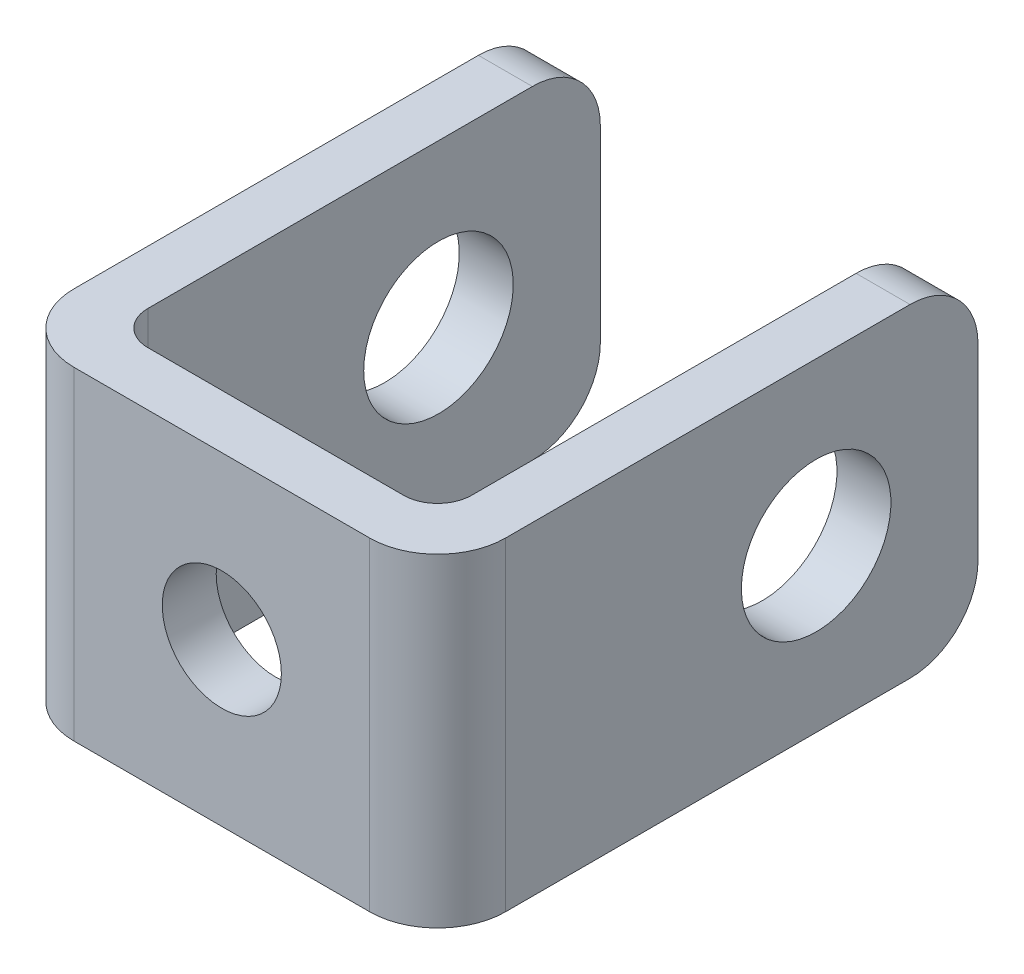
ISO-10303-21;
HEADER;
FILE_DESCRIPTION(('STEP AP214'),'2;1');
FILE_NAME('part.step','',(''),(''),'','','');
FILE_SCHEMA(('AUTOMOTIVE_DESIGN { 1 0 10303 214 1 1 1 1 }'));
ENDSEC;
DATA;
#1=APPLICATION_CONTEXT('core data for automotive mechanical design processes');
#2=APPLICATION_PROTOCOL_DEFINITION('international standard','automotive_design',2000,#1);
#3=PRODUCT_CONTEXT('',#1,'mechanical');
#4=PRODUCT('Part','Part','',(#3));
#5=PRODUCT_RELATED_PRODUCT_CATEGORY('part','',(#4));
#6=PRODUCT_DEFINITION_FORMATION('','',#4);
#7=PRODUCT_DEFINITION_CONTEXT('part definition',#1,'design');
#8=PRODUCT_DEFINITION('design','',#6,#7);
#9=PRODUCT_DEFINITION_SHAPE('','',#8);
#10=(LENGTH_UNIT() NAMED_UNIT(*) SI_UNIT(.MILLI.,.METRE.));
#11=(NAMED_UNIT(*) PLANE_ANGLE_UNIT() SI_UNIT($,.RADIAN.));
#12=(NAMED_UNIT(*) SI_UNIT($,.STERADIAN.) SOLID_ANGLE_UNIT());
#13=UNCERTAINTY_MEASURE_WITH_UNIT(LENGTH_MEASURE(1.E-05),#10,'distance_accuracy_value','');
#14=(GEOMETRIC_REPRESENTATION_CONTEXT(3) GLOBAL_UNCERTAINTY_ASSIGNED_CONTEXT((#13)) GLOBAL_UNIT_ASSIGNED_CONTEXT((#10,
#11,#12)) REPRESENTATION_CONTEXT('',''));
#15=CARTESIAN_POINT('',(0.,0.,0.));
#16=DIRECTION('',(0.,0.,1.));
#17=DIRECTION('',(1.,0.,0.));
#18=AXIS2_PLACEMENT_3D('',#15,#16,#17);
#19=CARTESIAN_POINT('',(12.7,9.525,15.9004));
#20=DIRECTION('',(-1.,0.,0.));
#21=DIRECTION('',(0.,0.,1.));
#22=AXIS2_PLACEMENT_3D('',#19,#20,#21);
#23=PLANE('',#22);
#24=CARTESIAN_POINT('',(12.7,4.7625,4.7625));
#25=DIRECTION('',(-1.,0.,0.));
#26=DIRECTION('',(0.,0.,1.));
#27=AXIS2_PLACEMENT_3D('',#24,#25,#26);
#28=CIRCLE('',#27,2.2);
#29=CARTESIAN_POINT('',(12.7,4.7625,6.9625));
#30=VERTEX_POINT('',#29);
#31=EDGE_CURVE('E351',#30,#30,#28,.T.);
#32=ORIENTED_EDGE('',*,*,#31,.T.);
#33=EDGE_LOOP('',(#32));
#34=FACE_BOUND('',#33,.T.);
#35=DIRECTION('',(0.,0.,-1.));
#36=VECTOR('',#35,1.);
#37=CARTESIAN_POINT('',(12.7,0.,15.9004));
#38=LINE('',#37,#36);
#39=CARTESIAN_POINT('',(12.7,0.,13.9004));
#40=VERTEX_POINT('',#39);
#41=CARTESIAN_POINT('',(12.7,0.,2.));
#42=VERTEX_POINT('',#41);
#43=EDGE_CURVE('E326',#40,#42,#38,.T.);
#44=ORIENTED_EDGE('',*,*,#43,.T.);
#45=CARTESIAN_POINT('',(12.7,2.,2.));
#46=DIRECTION('',(-1.,0.,0.));
#47=DIRECTION('',(0.,0.,1.));
#48=AXIS2_PLACEMENT_3D('',#45,#46,#47);
#49=CIRCLE('',#48,2.);
#50=CARTESIAN_POINT('',(12.7,2.,0.));
#51=VERTEX_POINT('',#50);
#52=EDGE_CURVE('E265',#42,#51,#49,.F.);
#53=ORIENTED_EDGE('',*,*,#52,.T.);
#54=DIRECTION('',(0.,-1.,0.));
#55=VECTOR('',#54,1.);
#56=CARTESIAN_POINT('',(12.7,9.525,0.));
#57=LINE('',#56,#55);
#58=CARTESIAN_POINT('',(12.7,7.525,0.));
#59=VERTEX_POINT('',#58);
#60=EDGE_CURVE('E186',#59,#51,#57,.T.);
#61=ORIENTED_EDGE('',*,*,#60,.F.);
#62=CARTESIAN_POINT('',(12.7,7.525,2.));
#63=DIRECTION('',(-1.,0.,0.));
#64=DIRECTION('',(0.,0.,1.));
#65=AXIS2_PLACEMENT_3D('',#62,#63,#64);
#66=CIRCLE('',#65,2.);
#67=CARTESIAN_POINT('',(12.7,9.525,2.));
#68=VERTEX_POINT('',#67);
#69=EDGE_CURVE('E262',#59,#68,#66,.F.);
#70=ORIENTED_EDGE('',*,*,#69,.T.);
#71=DIRECTION('',(0.,0.,-1.));
#72=VECTOR('',#71,1.);
#73=CARTESIAN_POINT('',(12.7,9.525,15.9004));
#74=LINE('',#73,#72);
#75=CARTESIAN_POINT('',(12.7,9.525,13.9004));
#76=VERTEX_POINT('',#75);
#77=EDGE_CURVE('E317',#76,#68,#74,.T.);
#78=ORIENTED_EDGE('',*,*,#77,.F.);
#79=DIRECTION('',(0.,-1.,0.));
#80=VECTOR('',#79,1.);
#81=CARTESIAN_POINT('',(12.7,9.525,13.9004));
#82=LINE('',#81,#80);
#83=EDGE_CURVE('E208',#76,#40,#82,.T.);
#84=ORIENTED_EDGE('',*,*,#83,.T.);
#85=EDGE_LOOP('',(#44,#53,#61,#70,#78,#84));
#86=FACE_BOUND('',#85,.T.);
#87=ADVANCED_FACE('F39',(#34,#86),#23,.F.);
#88=CARTESIAN_POINT('',(11.1125,9.525,0.));
#89=DIRECTION('',(0.,0.,-1.));
#90=DIRECTION('',(-1.,0.,0.));
#91=AXIS2_PLACEMENT_3D('',#88,#89,#90);
#92=PLANE('',#91);
#93=ORIENTED_EDGE('',*,*,#60,.T.);
#94=DIRECTION('',(1.,0.,0.));
#95=VECTOR('',#94,1.);
#96=CARTESIAN_POINT('',(11.1125,2.,0.));
#97=LINE('',#96,#95);
#98=CARTESIAN_POINT('',(11.1125,2.,0.));
#99=VERTEX_POINT('',#98);
#100=EDGE_CURVE('E61',#51,#99,#97,.F.);
#101=ORIENTED_EDGE('',*,*,#100,.T.);
#102=DIRECTION('',(0.,-1.,0.));
#103=VECTOR('',#102,1.);
#104=CARTESIAN_POINT('',(11.1125,9.525,0.));
#105=LINE('',#104,#103);
#106=CARTESIAN_POINT('',(11.1125,7.525,0.));
#107=VERTEX_POINT('',#106);
#108=EDGE_CURVE('E192',#107,#99,#105,.T.);
#109=ORIENTED_EDGE('',*,*,#108,.F.);
#110=DIRECTION('',(1.,0.,0.));
#111=VECTOR('',#110,1.);
#112=CARTESIAN_POINT('',(12.7,7.525,0.));
#113=LINE('',#112,#111);
#114=EDGE_CURVE('E268',#107,#59,#113,.T.);
#115=ORIENTED_EDGE('',*,*,#114,.T.);
#116=EDGE_LOOP('',(#93,#101,#109,#115));
#117=FACE_BOUND('',#116,.T.);
#118=ADVANCED_FACE('F390',(#117),#92,.T.);
#119=CARTESIAN_POINT('',(11.1125,9.525,15.9004));
#120=DIRECTION('',(-1.,0.,0.));
#121=DIRECTION('',(0.,0.,1.));
#122=AXIS2_PLACEMENT_3D('',#119,#120,#121);
#123=PLANE('',#122);
#124=CARTESIAN_POINT('',(11.1125,4.7625,4.7625));
#125=DIRECTION('',(-1.,0.,0.));
#126=DIRECTION('',(0.,0.,1.));
#127=AXIS2_PLACEMENT_3D('',#124,#125,#126);
#128=CIRCLE('',#127,2.2);
#129=CARTESIAN_POINT('',(11.1125,4.7625,6.9625));
#130=VERTEX_POINT('',#129);
#131=EDGE_CURVE('E330',#130,#130,#128,.T.);
#132=ORIENTED_EDGE('',*,*,#131,.F.);
#133=EDGE_LOOP('',(#132));
#134=FACE_BOUND('',#133,.T.);
#135=ORIENTED_EDGE('',*,*,#108,.T.);
#136=CARTESIAN_POINT('',(11.1125,2.,2.));
#137=DIRECTION('',(-1.,0.,0.));
#138=DIRECTION('',(0.,0.,1.));
#139=AXIS2_PLACEMENT_3D('',#136,#137,#138);
#140=CIRCLE('',#139,2.);
#141=CARTESIAN_POINT('',(11.1125,0.,2.));
#142=VERTEX_POINT('',#141);
#143=EDGE_CURVE('E277',#99,#142,#140,.T.);
#144=ORIENTED_EDGE('',*,*,#143,.T.);
#145=DIRECTION('',(0.,0.,-1.));
#146=VECTOR('',#145,1.);
#147=CARTESIAN_POINT('',(11.1125,0.,15.9004));
#148=LINE('',#147,#146);
#149=CARTESIAN_POINT('',(11.1125,0.,13.3129));
#150=VERTEX_POINT('',#149);
#151=EDGE_CURVE('E180',#150,#142,#148,.T.);
#152=ORIENTED_EDGE('',*,*,#151,.F.);
#153=DIRECTION('',(0.,-1.,0.));
#154=VECTOR('',#153,1.);
#155=CARTESIAN_POINT('',(11.1125,9.525,13.3129));
#156=LINE('',#155,#154);
#157=CARTESIAN_POINT('',(11.1125,9.525,13.3129));
#158=VERTEX_POINT('',#157);
#159=EDGE_CURVE('E190',#150,#158,#156,.F.);
#160=ORIENTED_EDGE('',*,*,#159,.T.);
#161=DIRECTION('',(0.,0.,-1.));
#162=VECTOR('',#161,1.);
#163=CARTESIAN_POINT('',(11.1125,9.525,15.9004));
#164=LINE('',#163,#162);
#165=CARTESIAN_POINT('',(11.1125,9.525,2.));
#166=VERTEX_POINT('',#165);
#167=EDGE_CURVE('E339',#158,#166,#164,.T.);
#168=ORIENTED_EDGE('',*,*,#167,.T.);
#169=CARTESIAN_POINT('',(11.1125,7.525,2.));
#170=DIRECTION('',(-1.,0.,0.));
#171=DIRECTION('',(0.,0.,1.));
#172=AXIS2_PLACEMENT_3D('',#169,#170,#171);
#173=CIRCLE('',#172,2.);
#174=EDGE_CURVE('E274',#166,#107,#173,.T.);
#175=ORIENTED_EDGE('',*,*,#174,.T.);
#176=EDGE_LOOP('',(#135,#144,#152,#160,#168,#175));
#177=FACE_BOUND('',#176,.T.);
#178=ADVANCED_FACE('F393',(#134,#177),#123,.T.);
#179=CARTESIAN_POINT('',(0.,9.525,14.3129));
#180=DIRECTION('',(0.,0.,-1.));
#181=DIRECTION('',(-1.,0.,0.));
#182=AXIS2_PLACEMENT_3D('',#179,#180,#181);
#183=PLANE('',#182);
#184=CARTESIAN_POINT('',(6.35,4.7625,14.3129));
#185=DIRECTION('',(0.,0.,-1.));
#186=DIRECTION('',(-1.,0.,0.));
#187=AXIS2_PLACEMENT_3D('',#184,#185,#186);
#188=CIRCLE('',#187,1.7525);
#189=CARTESIAN_POINT('',(4.5975,4.7625,14.3129));
#190=VERTEX_POINT('',#189);
#191=EDGE_CURVE('E360',#190,#190,#188,.F.);
#192=ORIENTED_EDGE('',*,*,#191,.T.);
#193=EDGE_LOOP('',(#192));
#194=FACE_BOUND('',#193,.T.);
#195=DIRECTION('',(1.,0.,0.));
#196=VECTOR('',#195,1.);
#197=CARTESIAN_POINT('',(0.,9.525,14.3129));
#198=LINE('',#197,#196);
#199=CARTESIAN_POINT('',(2.5875,9.525,14.3129));
#200=VERTEX_POINT('',#199);
#201=CARTESIAN_POINT('',(10.1125,9.525,14.3129));
#202=VERTEX_POINT('',#201);
#203=EDGE_CURVE('E336',#200,#202,#198,.T.);
#204=ORIENTED_EDGE('',*,*,#203,.T.);
#205=DIRECTION('',(0.,-1.,0.));
#206=VECTOR('',#205,1.);
#207=CARTESIAN_POINT('',(10.1125,0.,14.3129));
#208=LINE('',#207,#206);
#209=CARTESIAN_POINT('',(10.1125,0.,14.3129));
#210=VERTEX_POINT('',#209);
#211=EDGE_CURVE('E178',#202,#210,#208,.T.);
#212=ORIENTED_EDGE('',*,*,#211,.T.);
#213=DIRECTION('',(1.,0.,0.));
#214=VECTOR('',#213,1.);
#215=CARTESIAN_POINT('',(0.,0.,14.3129));
#216=LINE('',#215,#214);
#217=CARTESIAN_POINT('',(2.5875,0.,14.3129));
#218=VERTEX_POINT('',#217);
#219=EDGE_CURVE('E159',#218,#210,#216,.T.);
#220=ORIENTED_EDGE('',*,*,#219,.F.);
#221=DIRECTION('',(0.,-1.,0.));
#222=VECTOR('',#221,1.);
#223=CARTESIAN_POINT('',(2.5875,9.525,14.3129));
#224=LINE('',#223,#222);
#225=EDGE_CURVE('E175',#218,#200,#224,.F.);
#226=ORIENTED_EDGE('',*,*,#225,.T.);
#227=EDGE_LOOP('',(#204,#212,#220,#226));
#228=FACE_BOUND('',#227,.T.);
#229=ADVANCED_FACE('F174',(#194,#228),#183,.T.);
#230=CARTESIAN_POINT('',(1.5875,9.525,0.));
#231=DIRECTION('',(1.,0.,0.));
#232=DIRECTION('',(0.,0.,-1.));
#233=AXIS2_PLACEMENT_3D('',#230,#231,#232);
#234=PLANE('',#233);
#235=CARTESIAN_POINT('',(1.5875,4.7625,4.7625));
#236=DIRECTION('',(1.,0.,0.));
#237=DIRECTION('',(0.,0.,-1.));
#238=AXIS2_PLACEMENT_3D('',#235,#236,#237);
#239=CIRCLE('',#238,2.2);
#240=CARTESIAN_POINT('',(1.5875,4.7625,6.9625));
#241=VERTEX_POINT('',#240);
#242=EDGE_CURVE('E347',#241,#241,#239,.T.);
#243=ORIENTED_EDGE('',*,*,#242,.F.);
#244=EDGE_LOOP('',(#243));
#245=FACE_BOUND('',#244,.T.);
#246=DIRECTION('',(0.,0.,1.));
#247=VECTOR('',#246,1.);
#248=CARTESIAN_POINT('',(1.5875,0.,0.));
#249=LINE('',#248,#247);
#250=CARTESIAN_POINT('',(1.5875,0.,2.));
#251=VERTEX_POINT('',#250);
#252=CARTESIAN_POINT('',(1.5875,0.,13.3129));
#253=VERTEX_POINT('',#252);
#254=EDGE_CURVE('E162',#251,#253,#249,.T.);
#255=ORIENTED_EDGE('',*,*,#254,.F.);
#256=CARTESIAN_POINT('',(1.5875,2.,2.));
#257=DIRECTION('',(1.,0.,0.));
#258=DIRECTION('',(0.,0.,-1.));
#259=AXIS2_PLACEMENT_3D('',#256,#257,#258);
#260=CIRCLE('',#259,2.);
#261=CARTESIAN_POINT('',(1.5875,2.,0.));
#262=VERTEX_POINT('',#261);
#263=EDGE_CURVE('E246',#251,#262,#260,.T.);
#264=ORIENTED_EDGE('',*,*,#263,.T.);
#265=DIRECTION('',(0.,-1.,0.));
#266=VECTOR('',#265,1.);
#267=CARTESIAN_POINT('',(1.5875,9.525,0.));
#268=LINE('',#267,#266);
#269=CARTESIAN_POINT('',(1.5875,7.525,0.));
#270=VERTEX_POINT('',#269);
#271=EDGE_CURVE('E302',#270,#262,#268,.T.);
#272=ORIENTED_EDGE('',*,*,#271,.F.);
#273=CARTESIAN_POINT('',(1.5875,7.525,2.));
#274=DIRECTION('',(1.,0.,0.));
#275=DIRECTION('',(0.,0.,-1.));
#276=AXIS2_PLACEMENT_3D('',#273,#274,#275);
#277=CIRCLE('',#276,2.);
#278=CARTESIAN_POINT('',(1.5875,9.525,2.));
#279=VERTEX_POINT('',#278);
#280=EDGE_CURVE('E243',#270,#279,#277,.T.);
#281=ORIENTED_EDGE('',*,*,#280,.T.);
#282=DIRECTION('',(0.,0.,1.));
#283=VECTOR('',#282,1.);
#284=CARTESIAN_POINT('',(1.5875,9.525,0.));
#285=LINE('',#284,#283);
#286=CARTESIAN_POINT('',(1.5875,9.525,13.3129));
#287=VERTEX_POINT('',#286);
#288=EDGE_CURVE('E285',#279,#287,#285,.T.);
#289=ORIENTED_EDGE('',*,*,#288,.T.);
#290=DIRECTION('',(0.,-1.,0.));
#291=VECTOR('',#290,1.);
#292=CARTESIAN_POINT('',(1.5875,0.,13.3129));
#293=LINE('',#292,#291);
#294=EDGE_CURVE('E198',#287,#253,#293,.T.);
#295=ORIENTED_EDGE('',*,*,#294,.T.);
#296=EDGE_LOOP('',(#255,#264,#272,#281,#289,#295));
#297=FACE_BOUND('',#296,.T.);
#298=ADVANCED_FACE('F306',(#245,#297),#234,.T.);
#299=CARTESIAN_POINT('',(0.,9.525,0.));
#300=DIRECTION('',(0.,0.,-1.));
#301=DIRECTION('',(-1.,0.,0.));
#302=AXIS2_PLACEMENT_3D('',#299,#300,#301);
#303=PLANE('',#302);
#304=ORIENTED_EDGE('',*,*,#271,.T.);
#305=DIRECTION('',(1.,0.,0.));
#306=VECTOR('',#305,1.);
#307=CARTESIAN_POINT('',(0.,2.,0.));
#308=LINE('',#307,#306);
#309=CARTESIAN_POINT('',(0.,2.,0.));
#310=VERTEX_POINT('',#309);
#311=EDGE_CURVE('E253',#262,#310,#308,.F.);
#312=ORIENTED_EDGE('',*,*,#311,.T.);
#313=DIRECTION('',(0.,-1.,0.));
#314=VECTOR('',#313,1.);
#315=CARTESIAN_POINT('',(0.,9.525,0.));
#316=LINE('',#315,#314);
#317=CARTESIAN_POINT('',(0.,7.525,0.));
#318=VERTEX_POINT('',#317);
#319=EDGE_CURVE('E304',#318,#310,#316,.T.);
#320=ORIENTED_EDGE('',*,*,#319,.F.);
#321=DIRECTION('',(1.,0.,0.));
#322=VECTOR('',#321,1.);
#323=CARTESIAN_POINT('',(1.5875,7.525,0.));
#324=LINE('',#323,#322);
#325=EDGE_CURVE('E249',#318,#270,#324,.T.);
#326=ORIENTED_EDGE('',*,*,#325,.T.);
#327=EDGE_LOOP('',(#304,#312,#320,#326));
#328=FACE_BOUND('',#327,.T.);
#329=ADVANCED_FACE('F301',(#328),#303,.T.);
#330=CARTESIAN_POINT('',(0.,9.525,0.));
#331=DIRECTION('',(1.,0.,0.));
#332=DIRECTION('',(0.,0.,-1.));
#333=AXIS2_PLACEMENT_3D('',#330,#331,#332);
#334=PLANE('',#333);
#335=CARTESIAN_POINT('',(0.,4.7625,4.7625));
#336=DIRECTION('',(-1.,0.,0.));
#337=DIRECTION('',(0.,0.,1.));
#338=AXIS2_PLACEMENT_3D('',#335,#336,#337);
#339=CIRCLE('',#338,2.2);
#340=CARTESIAN_POINT('',(0.,4.7625,6.9625));
#341=VERTEX_POINT('',#340);
#342=EDGE_CURVE('E352',#341,#341,#339,.T.);
#343=ORIENTED_EDGE('',*,*,#342,.F.);
#344=EDGE_LOOP('',(#343));
#345=FACE_BOUND('',#344,.T.);
#346=ORIENTED_EDGE('',*,*,#319,.T.);
#347=CARTESIAN_POINT('',(0.,2.,2.));
#348=DIRECTION('',(1.,0.,0.));
#349=DIRECTION('',(0.,0.,-1.));
#350=AXIS2_PLACEMENT_3D('',#347,#348,#349);
#351=CIRCLE('',#350,2.);
#352=CARTESIAN_POINT('',(0.,0.,2.));
#353=VERTEX_POINT('',#352);
#354=EDGE_CURVE('E259',#310,#353,#351,.F.);
#355=ORIENTED_EDGE('',*,*,#354,.T.);
#356=DIRECTION('',(0.,0.,1.));
#357=VECTOR('',#356,1.);
#358=CARTESIAN_POINT('',(0.,0.,0.));
#359=LINE('',#358,#357);
#360=CARTESIAN_POINT('',(0.,0.,13.9004));
#361=VERTEX_POINT('',#360);
#362=EDGE_CURVE('E318',#353,#361,#359,.T.);
#363=ORIENTED_EDGE('',*,*,#362,.T.);
#364=DIRECTION('',(0.,-1.,0.));
#365=VECTOR('',#364,1.);
#366=CARTESIAN_POINT('',(0.,9.525,13.9004));
#367=LINE('',#366,#365);
#368=CARTESIAN_POINT('',(0.,9.525,13.9004));
#369=VERTEX_POINT('',#368);
#370=EDGE_CURVE('E232',#361,#369,#367,.F.);
#371=ORIENTED_EDGE('',*,*,#370,.T.);
#372=DIRECTION('',(0.,0.,1.));
#373=VECTOR('',#372,1.);
#374=CARTESIAN_POINT('',(0.,9.525,0.));
#375=LINE('',#374,#373);
#376=CARTESIAN_POINT('',(0.,9.525,2.));
#377=VERTEX_POINT('',#376);
#378=EDGE_CURVE('E284',#377,#369,#375,.T.);
#379=ORIENTED_EDGE('',*,*,#378,.F.);
#380=CARTESIAN_POINT('',(0.,7.525,2.));
#381=DIRECTION('',(1.,0.,0.));
#382=DIRECTION('',(0.,0.,-1.));
#383=AXIS2_PLACEMENT_3D('',#380,#381,#382);
#384=CIRCLE('',#383,2.);
#385=EDGE_CURVE('E256',#377,#318,#384,.F.);
#386=ORIENTED_EDGE('',*,*,#385,.T.);
#387=EDGE_LOOP('',(#346,#355,#363,#371,#379,#386));
#388=FACE_BOUND('',#387,.T.);
#389=ADVANCED_FACE('F290',(#345,#388),#334,.F.);
#390=CARTESIAN_POINT('',(0.,9.525,15.9004));
#391=DIRECTION('',(0.,0.,-1.));
#392=DIRECTION('',(-1.,0.,0.));
#393=AXIS2_PLACEMENT_3D('',#390,#391,#392);
#394=PLANE('',#393);
#395=CARTESIAN_POINT('',(6.35,4.7625,15.9004));
#396=DIRECTION('',(0.,0.,1.));
#397=DIRECTION('',(1.,0.,0.));
#398=AXIS2_PLACEMENT_3D('',#395,#396,#397);
#399=CIRCLE('',#398,1.7525);
#400=CARTESIAN_POINT('',(8.1025,4.7625,15.9004));
#401=VERTEX_POINT('',#400);
#402=EDGE_CURVE('E356',#401,#401,#399,.T.);
#403=ORIENTED_EDGE('',*,*,#402,.F.);
#404=EDGE_LOOP('',(#403));
#405=FACE_BOUND('',#404,.T.);
#406=DIRECTION('',(1.,0.,0.));
#407=VECTOR('',#406,1.);
#408=CARTESIAN_POINT('',(0.,0.,15.9004));
#409=LINE('',#408,#407);
#410=CARTESIAN_POINT('',(2.,0.,15.9004));
#411=VERTEX_POINT('',#410);
#412=CARTESIAN_POINT('',(10.7,0.,15.9004));
#413=VERTEX_POINT('',#412);
#414=EDGE_CURVE('E313',#411,#413,#409,.T.);
#415=ORIENTED_EDGE('',*,*,#414,.T.);
#416=DIRECTION('',(0.,-1.,0.));
#417=VECTOR('',#416,1.);
#418=CARTESIAN_POINT('',(10.7,9.525,15.9004));
#419=LINE('',#418,#417);
#420=CARTESIAN_POINT('',(10.7,9.525,15.9004));
#421=VERTEX_POINT('',#420);
#422=EDGE_CURVE('E223',#413,#421,#419,.F.);
#423=ORIENTED_EDGE('',*,*,#422,.T.);
#424=DIRECTION('',(1.,0.,0.));
#425=VECTOR('',#424,1.);
#426=CARTESIAN_POINT('',(0.,9.525,15.9004));
#427=LINE('',#426,#425);
#428=CARTESIAN_POINT('',(2.,9.525,15.9004));
#429=VERTEX_POINT('',#428);
#430=EDGE_CURVE('E295',#429,#421,#427,.T.);
#431=ORIENTED_EDGE('',*,*,#430,.F.);
#432=DIRECTION('',(0.,-1.,0.));
#433=VECTOR('',#432,1.);
#434=CARTESIAN_POINT('',(2.,9.525,15.9004));
#435=LINE('',#434,#433);
#436=EDGE_CURVE('E219',#429,#411,#435,.T.);
#437=ORIENTED_EDGE('',*,*,#436,.T.);
#438=EDGE_LOOP('',(#415,#423,#431,#437));
#439=FACE_BOUND('',#438,.T.);
#440=ADVANCED_FACE('F370',(#405,#439),#394,.F.);
#441=CARTESIAN_POINT('',(0.,9.525,0.));
#442=DIRECTION('',(0.,-1.,0.));
#443=DIRECTION('',(-1.,0.,0.));
#444=AXIS2_PLACEMENT_3D('',#441,#442,#443);
#445=PLANE('',#444);
#446=ORIENTED_EDGE('',*,*,#77,.T.);
#447=DIRECTION('',(1.,0.,0.));
#448=VECTOR('',#447,1.);
#449=CARTESIAN_POINT('',(11.1125,9.525,2.));
#450=LINE('',#449,#448);
#451=EDGE_CURVE('E11',#68,#166,#450,.F.);
#452=ORIENTED_EDGE('',*,*,#451,.T.);
#453=ORIENTED_EDGE('',*,*,#167,.F.);
#454=CARTESIAN_POINT('',(10.1125,9.525,13.3129));
#455=DIRECTION('',(0.,-1.,0.));
#456=DIRECTION('',(0.,0.,-1.));
#457=AXIS2_PLACEMENT_3D('',#454,#455,#456);
#458=CIRCLE('',#457,1.);
#459=EDGE_CURVE('E169',#158,#202,#458,.T.);
#460=ORIENTED_EDGE('',*,*,#459,.T.);
#461=ORIENTED_EDGE('',*,*,#203,.F.);
#462=CARTESIAN_POINT('',(2.5875,9.525,13.3129));
#463=DIRECTION('',(0.,-1.,0.));
#464=DIRECTION('',(0.,0.,-1.));
#465=AXIS2_PLACEMENT_3D('',#462,#463,#464);
#466=CIRCLE('',#465,1.);
#467=EDGE_CURVE('E168',#200,#287,#466,.T.);
#468=ORIENTED_EDGE('',*,*,#467,.T.);
#469=ORIENTED_EDGE('',*,*,#288,.F.);
#470=DIRECTION('',(1.,0.,0.));
#471=VECTOR('',#470,1.);
#472=CARTESIAN_POINT('',(0.,9.525,2.));
#473=LINE('',#472,#471);
#474=EDGE_CURVE('E48',#279,#377,#473,.F.);
#475=ORIENTED_EDGE('',*,*,#474,.T.);
#476=ORIENTED_EDGE('',*,*,#378,.T.);
#477=CARTESIAN_POINT('',(2.,9.525,13.9004));
#478=DIRECTION('',(0.,-1.,0.));
#479=DIRECTION('',(0.,0.,-1.));
#480=AXIS2_PLACEMENT_3D('',#477,#478,#479);
#481=CIRCLE('',#480,2.);
#482=EDGE_CURVE('E226',#369,#429,#481,.F.);
#483=ORIENTED_EDGE('',*,*,#482,.T.);
#484=ORIENTED_EDGE('',*,*,#430,.T.);
#485=CARTESIAN_POINT('',(10.7,9.525,13.9004));
#486=DIRECTION('',(0.,-1.,0.));
#487=DIRECTION('',(0.,0.,-1.));
#488=AXIS2_PLACEMENT_3D('',#485,#486,#487);
#489=CIRCLE('',#488,2.);
#490=EDGE_CURVE('E229',#421,#76,#489,.F.);
#491=ORIENTED_EDGE('',*,*,#490,.T.);
#492=EDGE_LOOP('',(#446,#452,#453,#460,#461,#468,#469,#475,#476,#483,#484,#491));
#493=FACE_BOUND('',#492,.T.);
#494=ADVANCED_FACE('F283',(#493),#445,.F.);
#495=CARTESIAN_POINT('',(0.,0.,0.));
#496=DIRECTION('',(0.,-1.,0.));
#497=DIRECTION('',(-1.,0.,0.));
#498=AXIS2_PLACEMENT_3D('',#495,#496,#497);
#499=PLANE('',#498);
#500=ORIENTED_EDGE('',*,*,#362,.F.);
#501=DIRECTION('',(1.,0.,0.));
#502=VECTOR('',#501,1.);
#503=CARTESIAN_POINT('',(0.,0.,2.));
#504=LINE('',#503,#502);
#505=EDGE_CURVE('E240',#353,#251,#504,.T.);
#506=ORIENTED_EDGE('',*,*,#505,.T.);
#507=ORIENTED_EDGE('',*,*,#254,.T.);
#508=CARTESIAN_POINT('',(2.5875,0.,13.3129));
#509=DIRECTION('',(0.,-1.,0.));
#510=DIRECTION('',(0.,0.,-1.));
#511=AXIS2_PLACEMENT_3D('',#508,#509,#510);
#512=CIRCLE('',#511,1.);
#513=EDGE_CURVE('E155',#253,#218,#512,.F.);
#514=ORIENTED_EDGE('',*,*,#513,.T.);
#515=ORIENTED_EDGE('',*,*,#219,.T.);
#516=CARTESIAN_POINT('',(10.1125,0.,13.3129));
#517=DIRECTION('',(0.,-1.,0.));
#518=DIRECTION('',(0.,0.,-1.));
#519=AXIS2_PLACEMENT_3D('',#516,#517,#518);
#520=CIRCLE('',#519,1.);
#521=EDGE_CURVE('E201',#210,#150,#520,.F.);
#522=ORIENTED_EDGE('',*,*,#521,.T.);
#523=ORIENTED_EDGE('',*,*,#151,.T.);
#524=DIRECTION('',(1.,0.,0.));
#525=VECTOR('',#524,1.);
#526=CARTESIAN_POINT('',(0.,0.,2.));
#527=LINE('',#526,#525);
#528=EDGE_CURVE('E236',#142,#42,#527,.T.);
#529=ORIENTED_EDGE('',*,*,#528,.T.);
#530=ORIENTED_EDGE('',*,*,#43,.F.);
#531=CARTESIAN_POINT('',(10.7,0.,13.9004));
#532=DIRECTION('',(0.,-1.,0.));
#533=DIRECTION('',(0.,0.,-1.));
#534=AXIS2_PLACEMENT_3D('',#531,#532,#533);
#535=CIRCLE('',#534,2.);
#536=EDGE_CURVE('E216',#40,#413,#535,.T.);
#537=ORIENTED_EDGE('',*,*,#536,.T.);
#538=ORIENTED_EDGE('',*,*,#414,.F.);
#539=CARTESIAN_POINT('',(2.,0.,13.9004));
#540=DIRECTION('',(0.,-1.,0.));
#541=DIRECTION('',(0.,0.,-1.));
#542=AXIS2_PLACEMENT_3D('',#539,#540,#541);
#543=CIRCLE('',#542,2.);
#544=EDGE_CURVE('E212',#411,#361,#543,.T.);
#545=ORIENTED_EDGE('',*,*,#544,.T.);
#546=EDGE_LOOP('',(#500,#506,#507,#514,#515,#522,#523,#529,#530,#537,#538,#545));
#547=FACE_BOUND('',#546,.T.);
#548=ADVANCED_FACE('F158',(#547),#499,.T.);
#549=CARTESIAN_POINT('',(10.1125,9.525,13.3129));
#550=DIRECTION('',(0.,1.,0.));
#551=DIRECTION('',(0.,0.,1.));
#552=AXIS2_PLACEMENT_3D('',#549,#550,#551);
#553=CYLINDRICAL_SURFACE('',#552,1.);
#554=ORIENTED_EDGE('',*,*,#459,.F.);
#555=ORIENTED_EDGE('',*,*,#159,.F.);
#556=ORIENTED_EDGE('',*,*,#521,.F.);
#557=ORIENTED_EDGE('',*,*,#211,.F.);
#558=EDGE_LOOP('',(#554,#555,#556,#557));
#559=FACE_BOUND('',#558,.T.);
#560=ADVANCED_FACE('F401',(#559),#553,.F.);
#561=CARTESIAN_POINT('',(2.5875,9.525,13.3129));
#562=DIRECTION('',(0.,1.,0.));
#563=DIRECTION('',(0.,0.,1.));
#564=AXIS2_PLACEMENT_3D('',#561,#562,#563);
#565=CYLINDRICAL_SURFACE('',#564,1.);
#566=ORIENTED_EDGE('',*,*,#467,.F.);
#567=ORIENTED_EDGE('',*,*,#225,.F.);
#568=ORIENTED_EDGE('',*,*,#513,.F.);
#569=ORIENTED_EDGE('',*,*,#294,.F.);
#570=EDGE_LOOP('',(#566,#567,#568,#569));
#571=FACE_BOUND('',#570,.T.);
#572=ADVANCED_FACE('F183',(#571),#565,.F.);
#573=CARTESIAN_POINT('',(10.7,9.525,13.9004));
#574=DIRECTION('',(0.,-1.,0.));
#575=DIRECTION('',(0.,0.,-1.));
#576=AXIS2_PLACEMENT_3D('',#573,#574,#575);
#577=CYLINDRICAL_SURFACE('',#576,2.);
#578=ORIENTED_EDGE('',*,*,#490,.F.);
#579=ORIENTED_EDGE('',*,*,#422,.F.);
#580=ORIENTED_EDGE('',*,*,#536,.F.);
#581=ORIENTED_EDGE('',*,*,#83,.F.);
#582=EDGE_LOOP('',(#578,#579,#580,#581));
#583=FACE_BOUND('',#582,.T.);
#584=ADVANCED_FACE('F380',(#583),#577,.T.);
#585=CARTESIAN_POINT('',(2.,9.525,13.9004));
#586=DIRECTION('',(0.,-1.,0.));
#587=DIRECTION('',(0.,0.,-1.));
#588=AXIS2_PLACEMENT_3D('',#585,#586,#587);
#589=CYLINDRICAL_SURFACE('',#588,2.);
#590=ORIENTED_EDGE('',*,*,#482,.F.);
#591=ORIENTED_EDGE('',*,*,#370,.F.);
#592=ORIENTED_EDGE('',*,*,#544,.F.);
#593=ORIENTED_EDGE('',*,*,#436,.F.);
#594=EDGE_LOOP('',(#590,#591,#592,#593));
#595=FACE_BOUND('',#594,.T.);
#596=ADVANCED_FACE('F480',(#595),#589,.T.);
#597=CARTESIAN_POINT('',(0.,2.,2.));
#598=DIRECTION('',(1.,0.,0.));
#599=DIRECTION('',(0.,0.,-1.));
#600=AXIS2_PLACEMENT_3D('',#597,#598,#599);
#601=CYLINDRICAL_SURFACE('',#600,2.);
#602=ORIENTED_EDGE('',*,*,#354,.F.);
#603=ORIENTED_EDGE('',*,*,#311,.F.);
#604=ORIENTED_EDGE('',*,*,#263,.F.);
#605=ORIENTED_EDGE('',*,*,#505,.F.);
#606=EDGE_LOOP('',(#602,#603,#604,#605));
#607=FACE_BOUND('',#606,.T.);
#608=ADVANCED_FACE('F473',(#607),#601,.T.);
#609=CARTESIAN_POINT('',(0.,2.,2.));
#610=DIRECTION('',(1.,0.,0.));
#611=DIRECTION('',(0.,0.,-1.));
#612=AXIS2_PLACEMENT_3D('',#609,#610,#611);
#613=CYLINDRICAL_SURFACE('',#612,2.);
#614=ORIENTED_EDGE('',*,*,#143,.F.);
#615=ORIENTED_EDGE('',*,*,#100,.F.);
#616=ORIENTED_EDGE('',*,*,#52,.F.);
#617=ORIENTED_EDGE('',*,*,#528,.F.);
#618=EDGE_LOOP('',(#614,#615,#616,#617));
#619=FACE_BOUND('',#618,.T.);
#620=ADVANCED_FACE('F397',(#619),#613,.T.);
#621=CARTESIAN_POINT('',(11.1125,7.525,2.));
#622=DIRECTION('',(-1.,0.,0.));
#623=DIRECTION('',(0.,0.,1.));
#624=AXIS2_PLACEMENT_3D('',#621,#622,#623);
#625=CYLINDRICAL_SURFACE('',#624,2.);
#626=ORIENTED_EDGE('',*,*,#174,.F.);
#627=ORIENTED_EDGE('',*,*,#451,.F.);
#628=ORIENTED_EDGE('',*,*,#69,.F.);
#629=ORIENTED_EDGE('',*,*,#114,.F.);
#630=EDGE_LOOP('',(#626,#627,#628,#629));
#631=FACE_BOUND('',#630,.T.);
#632=ADVANCED_FACE('F389',(#631),#625,.T.);
#633=CARTESIAN_POINT('',(0.,7.525,2.));
#634=DIRECTION('',(-1.,0.,0.));
#635=DIRECTION('',(0.,0.,1.));
#636=AXIS2_PLACEMENT_3D('',#633,#634,#635);
#637=CYLINDRICAL_SURFACE('',#636,2.);
#638=ORIENTED_EDGE('',*,*,#385,.F.);
#639=ORIENTED_EDGE('',*,*,#474,.F.);
#640=ORIENTED_EDGE('',*,*,#280,.F.);
#641=ORIENTED_EDGE('',*,*,#325,.F.);
#642=EDGE_LOOP('',(#638,#639,#640,#641));
#643=FACE_BOUND('',#642,.T.);
#644=ADVANCED_FACE('F41',(#643),#637,.T.);
#645=CARTESIAN_POINT('',(12.7,4.7625,4.7625));
#646=DIRECTION('',(-1.,0.,0.));
#647=DIRECTION('',(0.,0.,1.));
#648=AXIS2_PLACEMENT_3D('',#645,#646,#647);
#649=CYLINDRICAL_SURFACE('',#648,2.2);
#650=CARTESIAN_POINT('',(1.5875,4.7625,6.9625));
#651=CARTESIAN_POINT('',(1.57096354166667,4.7625,6.9625));
#652=CARTESIAN_POINT('',(1.55442708333333,4.7625,6.9625));
#653=CARTESIAN_POINT('',(1.52135416666667,4.7625,6.9625));
#654=CARTESIAN_POINT('',(1.50481770833334,4.7625,6.9625));
#655=CARTESIAN_POINT('',(1.47174479166667,4.7625,6.9625));
#656=CARTESIAN_POINT('',(1.45520833333334,4.7625,6.9625));
#657=CARTESIAN_POINT('',(1.42213541666667,4.7625,6.9625));
#658=CARTESIAN_POINT('',(1.40559895833333,4.7625,6.9625));
#659=CARTESIAN_POINT('',(1.37252604166667,4.7625,6.9625));
#660=CARTESIAN_POINT('',(1.35598958333334,4.7625,6.9625));
#661=CARTESIAN_POINT('',(1.32291666666667,4.7625,6.9625));
#662=CARTESIAN_POINT('',(1.30638020833334,4.7625,6.9625));
#663=CARTESIAN_POINT('',(1.27330729166667,4.7625,6.9625));
#664=CARTESIAN_POINT('',(1.25677083333333,4.7625,6.9625));
#665=CARTESIAN_POINT('',(1.22369791666667,4.7625,6.9625));
#666=CARTESIAN_POINT('',(1.20716145833333,4.7625,6.9625));
#667=CARTESIAN_POINT('',(1.17408854166667,4.7625,6.9625));
#668=CARTESIAN_POINT('',(1.15755208333333,4.7625,6.9625));
#669=CARTESIAN_POINT('',(1.12447916666667,4.7625,6.9625));
#670=CARTESIAN_POINT('',(1.10794270833333,4.7625,6.9625));
#671=CARTESIAN_POINT('',(1.07486979166667,4.7625,6.9625));
#672=CARTESIAN_POINT('',(1.05833333333333,4.7625,6.9625));
#673=CARTESIAN_POINT('',(1.02526041666667,4.7625,6.9625));
#674=CARTESIAN_POINT('',(1.00872395833333,4.7625,6.9625));
#675=CARTESIAN_POINT('',(0.975651041666668,4.7625,6.9625));
#676=CARTESIAN_POINT('',(0.959114583333335,4.7625,6.9625));
#677=CARTESIAN_POINT('',(0.926041666666668,4.7625,6.9625));
#678=CARTESIAN_POINT('',(0.909505208333334,4.7625,6.9625));
#679=CARTESIAN_POINT('',(0.876432291666668,4.7625,6.9625));
#680=CARTESIAN_POINT('',(0.859895833333335,4.7625,6.9625));
#681=CARTESIAN_POINT('',(0.826822916666668,4.7625,6.9625));
#682=CARTESIAN_POINT('',(0.810286458333335,4.7625,6.9625));
#683=CARTESIAN_POINT('',(0.777213541666667,4.7625,6.9625));
#684=CARTESIAN_POINT('',(0.760677083333334,4.7625,6.9625));
#685=CARTESIAN_POINT('',(0.727604166666667,4.7625,6.9625));
#686=CARTESIAN_POINT('',(0.711067708333335,4.7625,6.9625));
#687=CARTESIAN_POINT('',(0.677994791666668,4.7625,6.9625));
#688=CARTESIAN_POINT('',(0.661458333333334,4.7625,6.9625));
#689=CARTESIAN_POINT('',(0.628385416666667,4.7625,6.9625));
#690=CARTESIAN_POINT('',(0.611848958333334,4.7625,6.9625));
#691=CARTESIAN_POINT('',(0.578776041666667,4.7625,6.9625));
#692=CARTESIAN_POINT('',(0.562239583333334,4.7625,6.9625));
#693=CARTESIAN_POINT('',(0.529166666666668,4.7625,6.9625));
#694=CARTESIAN_POINT('',(0.512630208333334,4.7625,6.9625));
#695=CARTESIAN_POINT('',(0.479557291666667,4.7625,6.9625));
#696=CARTESIAN_POINT('',(0.463020833333334,4.7625,6.9625));
#697=CARTESIAN_POINT('',(0.429947916666667,4.7625,6.9625));
#698=CARTESIAN_POINT('',(0.413411458333334,4.7625,6.9625));
#699=CARTESIAN_POINT('',(0.380338541666668,4.7625,6.9625));
#700=CARTESIAN_POINT('',(0.363802083333334,4.7625,6.9625));
#701=CARTESIAN_POINT('',(0.330729166666667,4.7625,6.9625));
#702=CARTESIAN_POINT('',(0.314192708333334,4.7625,6.9625));
#703=CARTESIAN_POINT('',(0.281119791666667,4.7625,6.9625));
#704=CARTESIAN_POINT('',(0.264583333333334,4.7625,6.9625));
#705=CARTESIAN_POINT('',(0.231510416666668,4.7625,6.9625));
#706=CARTESIAN_POINT('',(0.214973958333334,4.7625,6.9625));
#707=CARTESIAN_POINT('',(0.181901041666667,4.7625,6.9625));
#708=CARTESIAN_POINT('',(0.165364583333334,4.7625,6.9625));
#709=CARTESIAN_POINT('',(0.132291666666667,4.7625,6.9625));
#710=CARTESIAN_POINT('',(0.115755208333333,4.7625,6.9625));
#711=CARTESIAN_POINT('',(0.0826822916666665,4.7625,6.9625));
#712=CARTESIAN_POINT('',(0.0661458333333336,4.7625,6.9625));
#713=CARTESIAN_POINT('',(0.0330729166666671,4.7625,6.9625));
#714=CARTESIAN_POINT('',(0.0165364583333335,4.7625,6.9625));
#715=CARTESIAN_POINT('',(0.,4.7625,6.9625));
#716=B_SPLINE_CURVE_WITH_KNOTS('',3,(#650,#651,#652,#653,#654,#655,#656,#657,#658,#659,#660,
#661,#662,#663,#664,#665,#666,#667,#668,#669,#670,#671,#672,#673,#674,#675,#676,#677,#678,#679,
#680,#681,#682,#683,#684,#685,#686,#687,#688,#689,#690,#691,#692,#693,#694,#695,#696,#697,#698,
#699,#700,#701,#702,#703,#704,#705,#706,#707,#708,#709,#710,#711,#712,#713,#714,#715),
.UNSPECIFIED.,.F.,.F.,(4,2,2,2,2,2,2,2,2,2,2,2,2,2,2,2,2,2,2,2,2,2,2,2,2,2,2,2,2,2,2,2,4),(0.,
0.0496093750000006,0.0992187499999995,0.148828125,0.198437500000001,0.248046875,0.29765625,
0.347265625000001,0.396875000000001,0.446484375,0.496093750000001,0.545703125000002,0.5953125,
0.644921875000001,0.694531250000002,0.744140625,0.793750000000001,0.843359375000002,
0.892968750000001,0.942578125000001,0.992187500000002,1.041796875,1.09140625,1.141015625,
1.190625,1.240234375,1.28984375,1.339453125,1.3890625,1.438671875,1.48828125,1.537890625,
1.5875),.UNSPECIFIED.);
#717=EDGE_CURVE('BSEAM434',#241,#341,#716,.T.);
#718=ORIENTED_EDGE('',*,*,#242,.T.);
#719=ORIENTED_EDGE('',*,*,#342,.T.);
#720=ORIENTED_EDGE('',*,*,#717,.T.);
#721=ORIENTED_EDGE('',*,*,#717,.F.);
#722=EDGE_LOOP('',(#718,#720,#719,#721));
#723=FACE_BOUND('',#722,.T.);
#724=ADVANCED_FACE('F434',(#723),#649,.F.);
#725=CARTESIAN_POINT('',(11.1125,4.7625,6.9625));
#726=CARTESIAN_POINT('',(11.1290364583333,4.7625,6.9625));
#727=CARTESIAN_POINT('',(11.1455729166667,4.7625,6.9625));
#728=CARTESIAN_POINT('',(11.1786458333333,4.7625,6.9625));
#729=CARTESIAN_POINT('',(11.1951822916667,4.7625,6.9625));
#730=CARTESIAN_POINT('',(11.2282552083333,4.7625,6.9625));
#731=CARTESIAN_POINT('',(11.2447916666667,4.7625,6.9625));
#732=CARTESIAN_POINT('',(11.2778645833333,4.7625,6.9625));
#733=CARTESIAN_POINT('',(11.2944010416667,4.7625,6.9625));
#734=CARTESIAN_POINT('',(11.3274739583333,4.7625,6.9625));
#735=CARTESIAN_POINT('',(11.3440104166667,4.7625,6.9625));
#736=CARTESIAN_POINT('',(11.3770833333333,4.7625,6.9625));
#737=CARTESIAN_POINT('',(11.3936197916667,4.7625,6.9625));
#738=CARTESIAN_POINT('',(11.4266927083333,4.7625,6.9625));
#739=CARTESIAN_POINT('',(11.4432291666667,4.7625,6.9625));
#740=CARTESIAN_POINT('',(11.4763020833333,4.7625,6.9625));
#741=CARTESIAN_POINT('',(11.4928385416667,4.7625,6.9625));
#742=CARTESIAN_POINT('',(11.5259114583333,4.7625,6.9625));
#743=CARTESIAN_POINT('',(11.5424479166667,4.7625,6.9625));
#744=CARTESIAN_POINT('',(11.5755208333333,4.7625,6.9625));
#745=CARTESIAN_POINT('',(11.5920572916667,4.7625,6.9625));
#746=CARTESIAN_POINT('',(11.6251302083333,4.7625,6.9625));
#747=CARTESIAN_POINT('',(11.6416666666667,4.7625,6.9625));
#748=CARTESIAN_POINT('',(11.6747395833333,4.7625,6.9625));
#749=CARTESIAN_POINT('',(11.6912760416667,4.7625,6.9625));
#750=CARTESIAN_POINT('',(11.7243489583333,4.7625,6.9625));
#751=CARTESIAN_POINT('',(11.7408854166667,4.7625,6.9625));
#752=CARTESIAN_POINT('',(11.7739583333333,4.7625,6.9625));
#753=CARTESIAN_POINT('',(11.7904947916667,4.7625,6.9625));
#754=CARTESIAN_POINT('',(11.8235677083333,4.7625,6.9625));
#755=CARTESIAN_POINT('',(11.8401041666667,4.7625,6.9625));
#756=CARTESIAN_POINT('',(11.8731770833333,4.7625,6.9625));
#757=CARTESIAN_POINT('',(11.8897135416667,4.7625,6.9625));
#758=CARTESIAN_POINT('',(11.9227864583333,4.7625,6.9625));
#759=CARTESIAN_POINT('',(11.9393229166667,4.7625,6.9625));
#760=CARTESIAN_POINT('',(11.9723958333333,4.7625,6.9625));
#761=CARTESIAN_POINT('',(11.9889322916667,4.7625,6.9625));
#762=CARTESIAN_POINT('',(12.0220052083333,4.7625,6.9625));
#763=CARTESIAN_POINT('',(12.0385416666667,4.7625,6.9625));
#764=CARTESIAN_POINT('',(12.0716145833333,4.7625,6.9625));
#765=CARTESIAN_POINT('',(12.0881510416667,4.7625,6.9625));
#766=CARTESIAN_POINT('',(12.1212239583333,4.7625,6.9625));
#767=CARTESIAN_POINT('',(12.1377604166667,4.7625,6.9625));
#768=CARTESIAN_POINT('',(12.1708333333333,4.7625,6.9625));
#769=CARTESIAN_POINT('',(12.1873697916667,4.7625,6.9625));
#770=CARTESIAN_POINT('',(12.2204427083333,4.7625,6.9625));
#771=CARTESIAN_POINT('',(12.2369791666667,4.7625,6.9625));
#772=CARTESIAN_POINT('',(12.2700520833333,4.7625,6.9625));
#773=CARTESIAN_POINT('',(12.2865885416667,4.7625,6.9625));
#774=CARTESIAN_POINT('',(12.3196614583333,4.7625,6.9625));
#775=CARTESIAN_POINT('',(12.3361979166667,4.7625,6.9625));
#776=CARTESIAN_POINT('',(12.3692708333333,4.7625,6.9625));
#777=CARTESIAN_POINT('',(12.3858072916667,4.7625,6.9625));
#778=CARTESIAN_POINT('',(12.4188802083333,4.7625,6.9625));
#779=CARTESIAN_POINT('',(12.4354166666667,4.7625,6.9625));
#780=CARTESIAN_POINT('',(12.4684895833333,4.7625,6.9625));
#781=CARTESIAN_POINT('',(12.4850260416667,4.7625,6.9625));
#782=CARTESIAN_POINT('',(12.5180989583333,4.7625,6.9625));
#783=CARTESIAN_POINT('',(12.5346354166667,4.7625,6.9625));
#784=CARTESIAN_POINT('',(12.5677083333333,4.7625,6.9625));
#785=CARTESIAN_POINT('',(12.5842447916667,4.7625,6.9625));
#786=CARTESIAN_POINT('',(12.6173177083333,4.7625,6.9625));
#787=CARTESIAN_POINT('',(12.6338541666667,4.7625,6.9625));
#788=CARTESIAN_POINT('',(12.6669270833333,4.7625,6.9625));
#789=CARTESIAN_POINT('',(12.6834635416667,4.7625,6.9625));
#790=CARTESIAN_POINT('',(12.7,4.7625,6.9625));
#791=B_SPLINE_CURVE_WITH_KNOTS('',3,(#725,#726,#727,#728,#729,#730,#731,#732,#733,#734,#735,
#736,#737,#738,#739,#740,#741,#742,#743,#744,#745,#746,#747,#748,#749,#750,#751,#752,#753,#754,
#755,#756,#757,#758,#759,#760,#761,#762,#763,#764,#765,#766,#767,#768,#769,#770,#771,#772,#773,
#774,#775,#776,#777,#778,#779,#780,#781,#782,#783,#784,#785,#786,#787,#788,#789,#790),
.UNSPECIFIED.,.F.,.F.,(4,2,2,2,2,2,2,2,2,2,2,2,2,2,2,2,2,2,2,2,2,2,2,2,2,2,2,2,2,2,2,2,4),(0.,
0.0496093749999989,0.0992187499999995,0.148828125,0.198437499999999,0.248046875,0.29765625,
0.347265624999999,0.396875,0.446484374999999,0.496093749999999,0.545703125,0.595312499999999,
0.644921874999999,0.69453125,0.744140624999999,0.793749999999999,0.843359375,0.892968749999999,
0.942578124999999,0.9921875,1.041796875,1.09140625,1.141015625,1.190625,1.240234375,1.28984375,
1.339453125,1.3890625,1.438671875,1.48828125,1.537890625,1.5875),.UNSPECIFIED.);
#792=EDGE_CURVE('BSEAM437',#130,#30,#791,.T.);
#793=ORIENTED_EDGE('',*,*,#131,.T.);
#794=ORIENTED_EDGE('',*,*,#31,.F.);
#795=ORIENTED_EDGE('',*,*,#792,.T.);
#796=ORIENTED_EDGE('',*,*,#792,.F.);
#797=EDGE_LOOP('',(#793,#795,#794,#796));
#798=FACE_BOUND('',#797,.T.);
#799=ADVANCED_FACE('F437',(#798),#649,.F.);
#800=CARTESIAN_POINT('',(6.35,4.7625,-0.001000000000001));
#801=DIRECTION('',(0.,0.,1.));
#802=DIRECTION('',(1.,0.,0.));
#803=AXIS2_PLACEMENT_3D('',#800,#801,#802);
#804=CYLINDRICAL_SURFACE('',#803,1.7525);
#805=ORIENTED_EDGE('',*,*,#191,.F.);
#806=EDGE_LOOP('',(#805));
#807=FACE_BOUND('',#806,.T.);
#808=ORIENTED_EDGE('',*,*,#402,.T.);
#809=EDGE_LOOP('',(#808));
#810=FACE_BOUND('',#809,.T.);
#811=ADVANCED_FACE('F368',(#807,#810),#804,.F.);
#812=CLOSED_SHELL('',(#87,#118,#178,#229,#298,#329,#389,#440,#494,#548,#560,#572,#584,#596,#608,
#620,#632,#644,#724,#799,#811));
#813=MANIFOLD_SOLID_BREP('B2',#812);
#814=ADVANCED_BREP_SHAPE_REPRESENTATION('',(#18,#813),#14);
#815=SHAPE_DEFINITION_REPRESENTATION(#9,#814);
ENDSEC;
END-ISO-10303-21;
